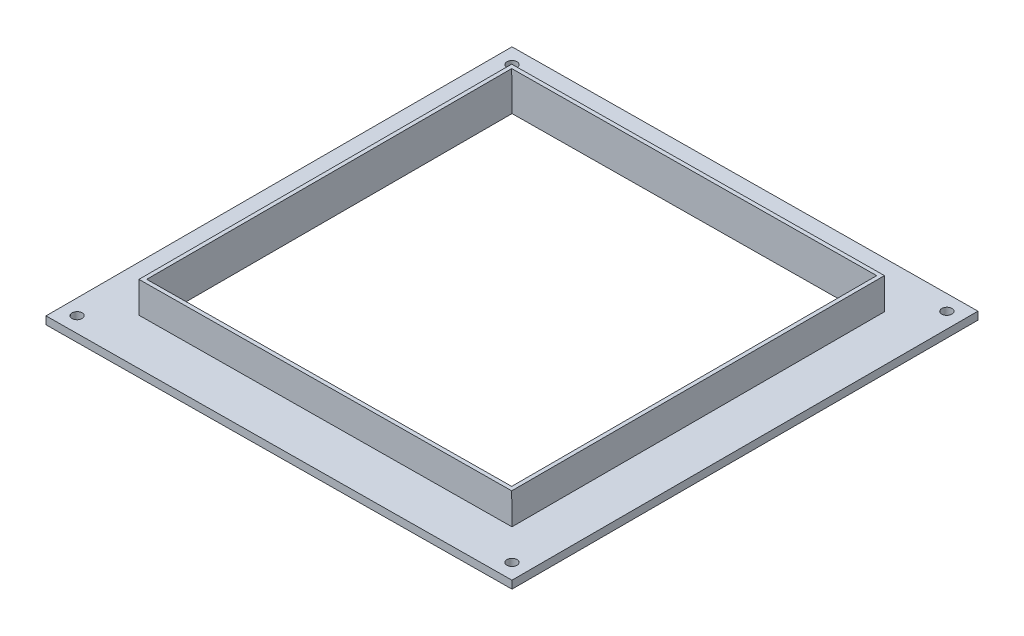
ISO-10303-21;
HEADER;
FILE_DESCRIPTION(('STEP AP214'),'2;1');
FILE_NAME('part.step','',(''),(''),'','','');
FILE_SCHEMA(('AUTOMOTIVE_DESIGN { 1 0 10303 214 1 1 1 1 }'));
ENDSEC;
DATA;
#1=APPLICATION_CONTEXT('core data for automotive mechanical design processes');
#2=APPLICATION_PROTOCOL_DEFINITION('international standard','automotive_design',2000,#1);
#3=PRODUCT_CONTEXT('',#1,'mechanical');
#4=PRODUCT('Part','Part','',(#3));
#5=PRODUCT_RELATED_PRODUCT_CATEGORY('part','',(#4));
#6=PRODUCT_DEFINITION_FORMATION('','',#4);
#7=PRODUCT_DEFINITION_CONTEXT('part definition',#1,'design');
#8=PRODUCT_DEFINITION('design','',#6,#7);
#9=PRODUCT_DEFINITION_SHAPE('','',#8);
#10=(LENGTH_UNIT() NAMED_UNIT(*) SI_UNIT(.MILLI.,.METRE.));
#11=(NAMED_UNIT(*) PLANE_ANGLE_UNIT() SI_UNIT($,.RADIAN.));
#12=(NAMED_UNIT(*) SI_UNIT($,.STERADIAN.) SOLID_ANGLE_UNIT());
#13=UNCERTAINTY_MEASURE_WITH_UNIT(LENGTH_MEASURE(1.E-05),#10,'distance_accuracy_value','');
#14=(GEOMETRIC_REPRESENTATION_CONTEXT(3) GLOBAL_UNCERTAINTY_ASSIGNED_CONTEXT((#13)) GLOBAL_UNIT_ASSIGNED_CONTEXT((#10,
#11,#12)) REPRESENTATION_CONTEXT('',''));
#15=CARTESIAN_POINT('',(0.,0.,0.));
#16=DIRECTION('',(0.,0.,1.));
#17=DIRECTION('',(1.,0.,0.));
#18=AXIS2_PLACEMENT_3D('',#15,#16,#17);
#19=CARTESIAN_POINT('',(-0.14700283086852,3.73493792949448,-300.));
#20=DIRECTION('',(0.,0.,-1.));
#21=DIRECTION('',(-0.999961923064156,-0.0087265355001616,0.));
#22=AXIS2_PLACEMENT_3D('',#19,#20,#21);
#23=PLANE('',#22);
#24=DIRECTION('',(0.999961923064156,0.0087265355001616,0.));
#25=VECTOR('',#24,1.);
#26=CARTESIAN_POINT('',(-0.103370153367727,-1.26487168582629,-300.));
#27=LINE('',#26,#25);
#28=CARTESIAN_POINT('',(-0.103370153367727,-1.26487168582629,-300.));
#29=VERTEX_POINT('',#28);
#30=CARTESIAN_POINT('',(299.885206765879,1.35308896422218,-300.));
#31=VERTEX_POINT('',#30);
#32=EDGE_CURVE('E180',#29,#31,#27,.T.);
#33=ORIENTED_EDGE('',*,*,#32,.F.);
#34=DIRECTION('',(0.0087265355001616,-0.999961923064156,0.));
#35=VECTOR('',#34,1.);
#36=CARTESIAN_POINT('',(-0.14700283086852,3.73493792949448,-300.));
#37=LINE('',#36,#35);
#38=CARTESIAN_POINT('',(-0.14700283086852,3.73493792949448,-300.));
#39=VERTEX_POINT('',#38);
#40=EDGE_CURVE('E168',#39,#29,#37,.T.);
#41=ORIENTED_EDGE('',*,*,#40,.F.);
#42=DIRECTION('',(0.999961923064156,0.0087265355001616,0.));
#43=VECTOR('',#42,1.);
#44=CARTESIAN_POINT('',(-0.14700283086852,3.73493792949448,-300.));
#45=LINE('',#44,#43);
#46=CARTESIAN_POINT('',(299.841574088378,6.35289857954296,-300.));
#47=VERTEX_POINT('',#46);
#48=EDGE_CURVE('E203',#39,#47,#45,.T.);
#49=ORIENTED_EDGE('',*,*,#48,.T.);
#50=DIRECTION('',(0.0087265355001616,-0.999961923064156,0.));
#51=VECTOR('',#50,1.);
#52=CARTESIAN_POINT('',(299.841574088378,6.35289857954296,-300.));
#53=LINE('',#52,#51);
#54=EDGE_CURVE('E197',#47,#31,#53,.T.);
#55=ORIENTED_EDGE('',*,*,#54,.T.);
#56=EDGE_LOOP('',(#33,#41,#49,#55));
#57=FACE_BOUND('',#56,.T.);
#58=ADVANCED_FACE('F64',(#57),#23,.T.);
#59=CARTESIAN_POINT('',(-0.14700283086852,3.73493792949448,0.));
#60=DIRECTION('',(-0.999961923064156,-0.0087265355001616,0.));
#61=DIRECTION('',(0.,0.,1.));
#62=AXIS2_PLACEMENT_3D('',#59,#60,#61);
#63=PLANE('',#62);
#64=DIRECTION('',(0.,0.,-1.));
#65=VECTOR('',#64,1.);
#66=CARTESIAN_POINT('',(-0.103370153367727,-1.26487168582629,0.));
#67=LINE('',#66,#65);
#68=CARTESIAN_POINT('',(-0.103370153367727,-1.26487168582629,0.));
#69=VERTEX_POINT('',#68);
#70=EDGE_CURVE('E206',#69,#29,#67,.T.);
#71=ORIENTED_EDGE('',*,*,#70,.F.);
#72=DIRECTION('',(0.0087265355001616,-0.999961923064156,0.));
#73=VECTOR('',#72,1.);
#74=CARTESIAN_POINT('',(-0.14700283086852,3.73493792949448,0.));
#75=LINE('',#74,#73);
#76=CARTESIAN_POINT('',(-0.14700283086852,3.73493792949448,0.));
#77=VERTEX_POINT('',#76);
#78=EDGE_CURVE('E192',#77,#69,#75,.T.);
#79=ORIENTED_EDGE('',*,*,#78,.F.);
#80=DIRECTION('',(0.,0.,-1.));
#81=VECTOR('',#80,1.);
#82=CARTESIAN_POINT('',(-0.14700283086852,3.73493792949448,0.));
#83=LINE('',#82,#81);
#84=EDGE_CURVE('E214',#77,#39,#83,.T.);
#85=ORIENTED_EDGE('',*,*,#84,.T.);
#86=ORIENTED_EDGE('',*,*,#40,.T.);
#87=EDGE_LOOP('',(#71,#79,#85,#86));
#88=FACE_BOUND('',#87,.T.);
#89=ADVANCED_FACE('F288',(#88),#63,.T.);
#90=CARTESIAN_POINT('',(-0.14700283086852,3.73493792949448,0.));
#91=DIRECTION('',(0.,0.,-1.));
#92=DIRECTION('',(-0.999961923064156,-0.0087265355001616,0.));
#93=AXIS2_PLACEMENT_3D('',#90,#91,#92);
#94=PLANE('',#93);
#95=DIRECTION('',(0.999961923064156,0.0087265355001616,0.));
#96=VECTOR('',#95,1.);
#97=CARTESIAN_POINT('',(-0.103370153367727,-1.26487168582629,0.));
#98=LINE('',#97,#96);
#99=CARTESIAN_POINT('',(299.885206765879,1.35308896422218,0.));
#100=VERTEX_POINT('',#99);
#101=EDGE_CURVE('E204',#69,#100,#98,.T.);
#102=ORIENTED_EDGE('',*,*,#101,.T.);
#103=DIRECTION('',(0.0087265355001616,-0.999961923064156,0.));
#104=VECTOR('',#103,1.);
#105=CARTESIAN_POINT('',(299.841574088378,6.35289857954296,0.));
#106=LINE('',#105,#104);
#107=CARTESIAN_POINT('',(299.841574088378,6.35289857954296,0.));
#108=VERTEX_POINT('',#107);
#109=EDGE_CURVE('E194',#108,#100,#106,.T.);
#110=ORIENTED_EDGE('',*,*,#109,.F.);
#111=DIRECTION('',(0.999961923064156,0.0087265355001616,0.));
#112=VECTOR('',#111,1.);
#113=CARTESIAN_POINT('',(-0.14700283086852,3.73493792949448,0.));
#114=LINE('',#113,#112);
#115=EDGE_CURVE('E212',#77,#108,#114,.T.);
#116=ORIENTED_EDGE('',*,*,#115,.F.);
#117=ORIENTED_EDGE('',*,*,#78,.T.);
#118=EDGE_LOOP('',(#102,#110,#116,#117));
#119=FACE_BOUND('',#118,.T.);
#120=ADVANCED_FACE('F293',(#119),#94,.F.);
#121=CARTESIAN_POINT('',(299.841574088378,6.35289857954296,0.));
#122=DIRECTION('',(-0.999961923064156,-0.0087265355001616,0.));
#123=DIRECTION('',(0.,0.,1.));
#124=AXIS2_PLACEMENT_3D('',#121,#122,#123);
#125=PLANE('',#124);
#126=DIRECTION('',(0.,0.,-1.));
#127=VECTOR('',#126,1.);
#128=CARTESIAN_POINT('',(299.885206765879,1.35308896422218,0.));
#129=LINE('',#128,#127);
#130=EDGE_CURVE('E200',#100,#31,#129,.T.);
#131=ORIENTED_EDGE('',*,*,#130,.T.);
#132=ORIENTED_EDGE('',*,*,#54,.F.);
#133=DIRECTION('',(0.,0.,-1.));
#134=VECTOR('',#133,1.);
#135=CARTESIAN_POINT('',(299.841574088378,6.35289857954296,0.));
#136=LINE('',#135,#134);
#137=EDGE_CURVE('E199',#108,#47,#136,.T.);
#138=ORIENTED_EDGE('',*,*,#137,.F.);
#139=ORIENTED_EDGE('',*,*,#109,.T.);
#140=EDGE_LOOP('',(#131,#132,#138,#139));
#141=FACE_BOUND('',#140,.T.);
#142=ADVANCED_FACE('F309',(#141),#125,.F.);
#143=CARTESIAN_POINT('',(-0.103370153367727,-1.26487168582629,0.));
#144=DIRECTION('',(-0.0087265355001616,0.999961923064156,0.));
#145=DIRECTION('',(0.,0.,1.));
#146=AXIS2_PLACEMENT_3D('',#143,#144,#145);
#147=PLANE('',#146);
#148=DIRECTION('',(-0.999961923064156,-0.0087265355001616,0.));
#149=VECTOR('',#148,1.);
#150=CARTESIAN_POINT('',(-0.103370153367727,-1.26487168582629,-267.5));
#151=LINE('',#150,#149);
#152=CARTESIAN_POINT('',(267.386444266294,1.06947656046694,-267.5));
#153=VERTEX_POINT('',#152);
#154=CARTESIAN_POINT('',(32.3953923462174,-0.981259282071045,-267.5));
#155=VERTEX_POINT('',#154);
#156=EDGE_CURVE('E71',#153,#155,#151,.T.);
#157=ORIENTED_EDGE('',*,*,#156,.T.);
#158=DIRECTION('',(0.,0.,1.));
#159=VECTOR('',#158,1.);
#160=CARTESIAN_POINT('',(32.3953923462174,-0.981259282071045,0.));
#161=LINE('',#160,#159);
#162=CARTESIAN_POINT('',(32.3953923462174,-0.981259282071045,-32.5));
#163=VERTEX_POINT('',#162);
#164=EDGE_CURVE('E12',#155,#163,#161,.T.);
#165=ORIENTED_EDGE('',*,*,#164,.T.);
#166=DIRECTION('',(0.999961923064156,0.0087265355001616,0.));
#167=VECTOR('',#166,1.);
#168=CARTESIAN_POINT('',(-0.103370153367727,-1.26487168582629,-32.5));
#169=LINE('',#168,#167);
#170=CARTESIAN_POINT('',(267.386444266294,1.06947656046694,-32.5));
#171=VERTEX_POINT('',#170);
#172=EDGE_CURVE('E163',#163,#171,#169,.T.);
#173=ORIENTED_EDGE('',*,*,#172,.T.);
#174=DIRECTION('',(0.,0.,-1.));
#175=VECTOR('',#174,1.);
#176=CARTESIAN_POINT('',(267.386444266294,1.06947656046694,0.));
#177=LINE('',#176,#175);
#178=EDGE_CURVE('E167',#171,#153,#177,.T.);
#179=ORIENTED_EDGE('',*,*,#178,.T.);
#180=EDGE_LOOP('',(#157,#165,#173,#179));
#181=FACE_BOUND('',#180,.T.);
#182=CARTESIAN_POINT('',(9.89624907727382,-1.17760633082467,-290.));
#183=DIRECTION('',(-0.0087265355001616,0.999961923064156,0.));
#184=DIRECTION('',(0.,0.,1.));
#185=AXIS2_PLACEMENT_3D('',#182,#183,#184);
#186=CIRCLE('',#185,3.25);
#187=CARTESIAN_POINT('',(9.89624907727382,-1.17760633082467,-286.75));
#188=VERTEX_POINT('',#187);
#189=EDGE_CURVE('E177',#188,#188,#186,.T.);
#190=ORIENTED_EDGE('',*,*,#189,.T.);
#191=EDGE_LOOP('',(#190));
#192=FACE_BOUND('',#191,.T.);
#193=CARTESIAN_POINT('',(289.885587535238,1.26582360922056,-290.));
#194=DIRECTION('',(-0.0087265355001616,0.999961923064156,0.));
#195=DIRECTION('',(0.,0.,1.));
#196=AXIS2_PLACEMENT_3D('',#193,#194,#195);
#197=CIRCLE('',#196,3.24999999999995);
#198=CARTESIAN_POINT('',(289.885587535238,1.26582360922056,-286.75));
#199=VERTEX_POINT('',#198);
#200=EDGE_CURVE('E181',#199,#199,#197,.T.);
#201=ORIENTED_EDGE('',*,*,#200,.T.);
#202=EDGE_LOOP('',(#201));
#203=FACE_BOUND('',#202,.T.);
#204=CARTESIAN_POINT('',(289.885587535238,1.26582360922056,-10.));
#205=DIRECTION('',(-0.0087265355001616,0.999961923064156,0.));
#206=DIRECTION('',(0.,0.,1.));
#207=AXIS2_PLACEMENT_3D('',#204,#205,#206);
#208=CIRCLE('',#207,3.24999999999995);
#209=CARTESIAN_POINT('',(289.885587535238,1.26582360922056,-6.75000000000005));
#210=VERTEX_POINT('',#209);
#211=EDGE_CURVE('E184',#210,#210,#208,.T.);
#212=ORIENTED_EDGE('',*,*,#211,.T.);
#213=EDGE_LOOP('',(#212));
#214=FACE_BOUND('',#213,.T.);
#215=CARTESIAN_POINT('',(9.89624907727382,-1.17760633082467,-10.));
#216=DIRECTION('',(-0.0087265355001616,0.999961923064156,0.));
#217=DIRECTION('',(0.,0.,1.));
#218=AXIS2_PLACEMENT_3D('',#215,#216,#217);
#219=CIRCLE('',#218,3.25);
#220=CARTESIAN_POINT('',(9.89624907727382,-1.17760633082467,-6.75));
#221=VERTEX_POINT('',#220);
#222=EDGE_CURVE('E187',#221,#221,#219,.T.);
#223=ORIENTED_EDGE('',*,*,#222,.T.);
#224=EDGE_LOOP('',(#223));
#225=FACE_BOUND('',#224,.T.);
#226=ORIENTED_EDGE('',*,*,#32,.T.);
#227=ORIENTED_EDGE('',*,*,#130,.F.);
#228=ORIENTED_EDGE('',*,*,#101,.F.);
#229=ORIENTED_EDGE('',*,*,#70,.T.);
#230=EDGE_LOOP('',(#226,#227,#228,#229));
#231=FACE_BOUND('',#230,.T.);
#232=ADVANCED_FACE('F170',(#181,#192,#203,#214,#225,#231),#147,.F.);
#233=CARTESIAN_POINT('',(10.0271471097763,-16.177035176787,-10.));
#234=DIRECTION('',(-0.0087265355001616,0.999961923064156,0.));
#235=DIRECTION('',(0.,0.,1.));
#236=AXIS2_PLACEMENT_3D('',#233,#234,#235);
#237=CYLINDRICAL_SURFACE('',#236,3.25);
#238=CARTESIAN_POINT('',(9.85261639977303,3.82220328449609,-10.));
#239=DIRECTION('',(-0.0087265355001616,0.999961923064156,0.));
#240=DIRECTION('',(0.,0.,1.));
#241=AXIS2_PLACEMENT_3D('',#238,#239,#240);
#242=CIRCLE('',#241,3.25);
#243=CARTESIAN_POINT('',(9.85261639977303,3.82220328449609,-6.75));
#244=VERTEX_POINT('',#243);
#245=EDGE_CURVE('E190',#244,#244,#242,.T.);
#246=ORIENTED_EDGE('',*,*,#245,.T.);
#247=EDGE_LOOP('',(#246));
#248=FACE_BOUND('',#247,.T.);
#249=ORIENTED_EDGE('',*,*,#222,.F.);
#250=EDGE_LOOP('',(#249));
#251=FACE_BOUND('',#250,.T.);
#252=ADVANCED_FACE('F320',(#248,#251),#237,.F.);
#253=CARTESIAN_POINT('',(290.01648556774,-13.7336052367418,-10.));
#254=DIRECTION('',(-0.0087265355001616,0.999961923064156,0.));
#255=DIRECTION('',(0.,0.,1.));
#256=AXIS2_PLACEMENT_3D('',#253,#254,#255);
#257=CYLINDRICAL_SURFACE('',#256,3.24999999999995);
#258=CARTESIAN_POINT('',(289.841954857737,6.26563322454135,-10.));
#259=DIRECTION('',(-0.0087265355001616,0.999961923064156,0.));
#260=DIRECTION('',(0.,0.,1.));
#261=AXIS2_PLACEMENT_3D('',#258,#259,#260);
#262=CIRCLE('',#261,3.24999999999995);
#263=CARTESIAN_POINT('',(289.841954857737,6.26563322454135,-6.75000000000005));
#264=VERTEX_POINT('',#263);
#265=EDGE_CURVE('E221',#264,#264,#262,.T.);
#266=ORIENTED_EDGE('',*,*,#265,.T.);
#267=EDGE_LOOP('',(#266));
#268=FACE_BOUND('',#267,.T.);
#269=ORIENTED_EDGE('',*,*,#211,.F.);
#270=EDGE_LOOP('',(#269));
#271=FACE_BOUND('',#270,.T.);
#272=ADVANCED_FACE('F327',(#268,#271),#257,.F.);
#273=CARTESIAN_POINT('',(290.01648556774,-13.7336052367418,-290.));
#274=DIRECTION('',(-0.0087265355001616,0.999961923064156,0.));
#275=DIRECTION('',(0.,0.,1.));
#276=AXIS2_PLACEMENT_3D('',#273,#274,#275);
#277=CYLINDRICAL_SURFACE('',#276,3.24999999999995);
#278=CARTESIAN_POINT('',(289.841954857737,6.26563322454135,-290.));
#279=DIRECTION('',(-0.0087265355001616,0.999961923064156,0.));
#280=DIRECTION('',(0.,0.,1.));
#281=AXIS2_PLACEMENT_3D('',#278,#279,#280);
#282=CIRCLE('',#281,3.24999999999995);
#283=CARTESIAN_POINT('',(289.841954857737,6.26563322454135,-286.75));
#284=VERTEX_POINT('',#283);
#285=EDGE_CURVE('E225',#284,#284,#282,.T.);
#286=ORIENTED_EDGE('',*,*,#285,.T.);
#287=EDGE_LOOP('',(#286));
#288=FACE_BOUND('',#287,.T.);
#289=ORIENTED_EDGE('',*,*,#200,.F.);
#290=EDGE_LOOP('',(#289));
#291=FACE_BOUND('',#290,.T.);
#292=ADVANCED_FACE('F331',(#288,#291),#277,.F.);
#293=CARTESIAN_POINT('',(10.0271471097763,-16.177035176787,-290.));
#294=DIRECTION('',(-0.0087265355001616,0.999961923064156,0.));
#295=DIRECTION('',(0.,0.,1.));
#296=AXIS2_PLACEMENT_3D('',#293,#294,#295);
#297=CYLINDRICAL_SURFACE('',#296,3.25);
#298=CARTESIAN_POINT('',(9.85261639977303,3.82220328449609,-290.));
#299=DIRECTION('',(-0.0087265355001616,0.999961923064156,0.));
#300=DIRECTION('',(0.,0.,1.));
#301=AXIS2_PLACEMENT_3D('',#298,#299,#300);
#302=CIRCLE('',#301,3.25);
#303=CARTESIAN_POINT('',(9.85261639977303,3.82220328449609,-286.75));
#304=VERTEX_POINT('',#303);
#305=EDGE_CURVE('E222',#304,#304,#302,.T.);
#306=ORIENTED_EDGE('',*,*,#305,.T.);
#307=EDGE_LOOP('',(#306));
#308=FACE_BOUND('',#307,.T.);
#309=ORIENTED_EDGE('',*,*,#189,.F.);
#310=EDGE_LOOP('',(#309));
#311=FACE_BOUND('',#310,.T.);
#312=ADVANCED_FACE('F324',(#308,#311),#297,.F.);
#313=CARTESIAN_POINT('',(-0.14700283086852,3.73493792949448,0.));
#314=DIRECTION('',(-0.0087265355001616,0.999961923064156,0.));
#315=DIRECTION('',(0.,0.,1.));
#316=AXIS2_PLACEMENT_3D('',#313,#314,#315);
#317=PLANE('',#316);
#318=DIRECTION('',(0.,0.,-1.));
#319=VECTOR('',#318,1.);
#320=CARTESIAN_POINT('',(29.8518548610562,3.99673399449935,0.));
#321=LINE('',#320,#319);
#322=CARTESIAN_POINT('',(29.8518548610562,3.99673399449935,-30.));
#323=VERTEX_POINT('',#322);
#324=CARTESIAN_POINT('',(29.8518548610562,3.99673399449935,-270.));
#325=VERTEX_POINT('',#324);
#326=EDGE_CURVE('E252',#323,#325,#321,.T.);
#327=ORIENTED_EDGE('',*,*,#326,.T.);
#328=DIRECTION('',(0.999961923064156,0.0087265355001616,0.));
#329=VECTOR('',#328,1.);
#330=CARTESIAN_POINT('',(-0.14700283086852,3.73493792949448,-270.));
#331=LINE('',#330,#329);
#332=CARTESIAN_POINT('',(269.842716396454,6.09110251453812,-270.));
#333=VERTEX_POINT('',#332);
#334=EDGE_CURVE('E245',#325,#333,#331,.T.);
#335=ORIENTED_EDGE('',*,*,#334,.T.);
#336=DIRECTION('',(0.,0.,-1.));
#337=VECTOR('',#336,1.);
#338=CARTESIAN_POINT('',(269.842716396454,6.09110251453812,0.));
#339=LINE('',#338,#337);
#340=CARTESIAN_POINT('',(269.842716396454,6.09110251453812,-30.));
#341=VERTEX_POINT('',#340);
#342=EDGE_CURVE('E248',#341,#333,#339,.T.);
#343=ORIENTED_EDGE('',*,*,#342,.F.);
#344=DIRECTION('',(0.999961923064156,0.0087265355001616,0.));
#345=VECTOR('',#344,1.);
#346=CARTESIAN_POINT('',(-0.14700283086852,3.73493792949448,-30.));
#347=LINE('',#346,#345);
#348=EDGE_CURVE('E86',#323,#341,#347,.T.);
#349=ORIENTED_EDGE('',*,*,#348,.F.);
#350=EDGE_LOOP('',(#327,#335,#343,#349));
#351=FACE_BOUND('',#350,.T.);
#352=ORIENTED_EDGE('',*,*,#305,.F.);
#353=EDGE_LOOP('',(#352));
#354=FACE_BOUND('',#353,.T.);
#355=ORIENTED_EDGE('',*,*,#285,.F.);
#356=EDGE_LOOP('',(#355));
#357=FACE_BOUND('',#356,.T.);
#358=ORIENTED_EDGE('',*,*,#265,.F.);
#359=EDGE_LOOP('',(#358));
#360=FACE_BOUND('',#359,.T.);
#361=ORIENTED_EDGE('',*,*,#245,.F.);
#362=EDGE_LOOP('',(#361));
#363=FACE_BOUND('',#362,.T.);
#364=ORIENTED_EDGE('',*,*,#48,.F.);
#365=ORIENTED_EDGE('',*,*,#84,.F.);
#366=ORIENTED_EDGE('',*,*,#115,.T.);
#367=ORIENTED_EDGE('',*,*,#137,.T.);
#368=EDGE_LOOP('',(#364,#365,#366,#367));
#369=FACE_BOUND('',#368,.T.);
#370=ADVANCED_FACE('F305',(#351,#354,#357,#360,#363,#369),#317,.T.);
#371=CARTESIAN_POINT('',(29.6773241510529,23.9959724557824,0.));
#372=DIRECTION('',(-0.999961923064156,-0.0087265355001616,0.));
#373=DIRECTION('',(0.,0.,1.));
#374=AXIS2_PLACEMENT_3D('',#371,#372,#373);
#375=PLANE('',#374);
#376=ORIENTED_EDGE('',*,*,#326,.F.);
#377=DIRECTION('',(0.0087265355001616,-0.999961923064156,0.));
#378=VECTOR('',#377,1.);
#379=CARTESIAN_POINT('',(29.6773241510529,23.9959724557824,-30.));
#380=LINE('',#379,#378);
#381=CARTESIAN_POINT('',(29.6773241510529,23.9959724557824,-30.));
#382=VERTEX_POINT('',#381);
#383=EDGE_CURVE('E226',#382,#323,#380,.T.);
#384=ORIENTED_EDGE('',*,*,#383,.F.);
#385=DIRECTION('',(0.,0.,-1.));
#386=VECTOR('',#385,1.);
#387=CARTESIAN_POINT('',(29.6773241510529,23.9959724557824,0.));
#388=LINE('',#387,#386);
#389=CARTESIAN_POINT('',(29.6773241510529,23.9959724557824,-270.));
#390=VERTEX_POINT('',#389);
#391=EDGE_CURVE('E261',#382,#390,#388,.T.);
#392=ORIENTED_EDGE('',*,*,#391,.T.);
#393=DIRECTION('',(0.0087265355001616,-0.999961923064156,0.));
#394=VECTOR('',#393,1.);
#395=CARTESIAN_POINT('',(29.6773241510529,23.9959724557824,-270.));
#396=LINE('',#395,#394);
#397=EDGE_CURVE('E159',#390,#325,#396,.T.);
#398=ORIENTED_EDGE('',*,*,#397,.T.);
#399=EDGE_LOOP('',(#376,#384,#392,#398));
#400=FACE_BOUND('',#399,.T.);
#401=ADVANCED_FACE('F323',(#400),#375,.T.);
#402=CARTESIAN_POINT('',(-0.321533540871749,23.7341763907776,-30.));
#403=DIRECTION('',(0.,0.,-1.));
#404=DIRECTION('',(-0.999961923064156,-0.0087265355001616,0.));
#405=AXIS2_PLACEMENT_3D('',#402,#403,#404);
#406=PLANE('',#405);
#407=ORIENTED_EDGE('',*,*,#348,.T.);
#408=DIRECTION('',(0.0087265355001616,-0.999961923064156,0.));
#409=VECTOR('',#408,1.);
#410=CARTESIAN_POINT('',(269.66818568645,26.0903409758212,-30.));
#411=LINE('',#410,#409);
#412=CARTESIAN_POINT('',(269.66818568645,26.0903409758212,-30.));
#413=VERTEX_POINT('',#412);
#414=EDGE_CURVE('E237',#413,#341,#411,.T.);
#415=ORIENTED_EDGE('',*,*,#414,.F.);
#416=DIRECTION('',(0.999961923064156,0.0087265355001616,0.));
#417=VECTOR('',#416,1.);
#418=CARTESIAN_POINT('',(-0.321533540871749,23.7341763907776,-30.));
#419=LINE('',#418,#417);
#420=EDGE_CURVE('E258',#382,#413,#419,.T.);
#421=ORIENTED_EDGE('',*,*,#420,.F.);
#422=ORIENTED_EDGE('',*,*,#383,.T.);
#423=EDGE_LOOP('',(#407,#415,#421,#422));
#424=FACE_BOUND('',#423,.T.);
#425=ADVANCED_FACE('F344',(#424),#406,.F.);
#426=CARTESIAN_POINT('',(269.66818568645,26.0903409758212,0.));
#427=DIRECTION('',(-0.999961923064156,-0.0087265355001616,0.));
#428=DIRECTION('',(0.,0.,1.));
#429=AXIS2_PLACEMENT_3D('',#426,#427,#428);
#430=PLANE('',#429);
#431=ORIENTED_EDGE('',*,*,#342,.T.);
#432=DIRECTION('',(0.0087265355001616,-0.999961923064156,0.));
#433=VECTOR('',#432,1.);
#434=CARTESIAN_POINT('',(269.66818568645,26.0903409758212,-270.));
#435=LINE('',#434,#433);
#436=CARTESIAN_POINT('',(269.66818568645,26.0903409758212,-270.));
#437=VERTEX_POINT('',#436);
#438=EDGE_CURVE('E240',#437,#333,#435,.T.);
#439=ORIENTED_EDGE('',*,*,#438,.F.);
#440=DIRECTION('',(0.,0.,-1.));
#441=VECTOR('',#440,1.);
#442=CARTESIAN_POINT('',(269.66818568645,26.0903409758212,0.));
#443=LINE('',#442,#441);
#444=EDGE_CURVE('E256',#413,#437,#443,.T.);
#445=ORIENTED_EDGE('',*,*,#444,.F.);
#446=ORIENTED_EDGE('',*,*,#414,.T.);
#447=EDGE_LOOP('',(#431,#439,#445,#446));
#448=FACE_BOUND('',#447,.T.);
#449=ADVANCED_FACE('F340',(#448),#430,.F.);
#450=CARTESIAN_POINT('',(-0.321533540871749,23.7341763907776,-32.5));
#451=DIRECTION('',(0.,0.,-1.));
#452=DIRECTION('',(-0.999961923064156,-0.0087265355001616,0.));
#453=AXIS2_PLACEMENT_3D('',#450,#451,#452);
#454=PLANE('',#453);
#455=DIRECTION('',(0.0087265355001616,-0.999961923064156,0.));
#456=VECTOR('',#455,1.);
#457=CARTESIAN_POINT('',(267.16828087879,26.0685246370709,-32.5));
#458=LINE('',#457,#456);
#459=CARTESIAN_POINT('',(267.16828087879,26.0685246370709,-32.5));
#460=VERTEX_POINT('',#459);
#461=EDGE_CURVE('E78',#460,#171,#458,.T.);
#462=ORIENTED_EDGE('',*,*,#461,.T.);
#463=ORIENTED_EDGE('',*,*,#172,.F.);
#464=DIRECTION('',(0.0087265355001616,-0.999961923064156,0.));
#465=VECTOR('',#464,1.);
#466=CARTESIAN_POINT('',(32.1772289587133,24.0177887945328,-32.5));
#467=LINE('',#466,#465);
#468=CARTESIAN_POINT('',(32.1772289587133,24.0177887945328,-32.5));
#469=VERTEX_POINT('',#468);
#470=EDGE_CURVE('E153',#469,#163,#467,.T.);
#471=ORIENTED_EDGE('',*,*,#470,.F.);
#472=DIRECTION('',(0.999961923064156,0.0087265355001616,0.));
#473=VECTOR('',#472,1.);
#474=CARTESIAN_POINT('',(-0.321533540871749,23.7341763907776,-32.5));
#475=LINE('',#474,#473);
#476=EDGE_CURVE('E247',#469,#460,#475,.T.);
#477=ORIENTED_EDGE('',*,*,#476,.T.);
#478=EDGE_LOOP('',(#462,#463,#471,#477));
#479=FACE_BOUND('',#478,.T.);
#480=ADVANCED_FACE('F164',(#479),#454,.T.);
#481=CARTESIAN_POINT('',(32.1772289587133,24.0177887945328,0.));
#482=DIRECTION('',(-0.999961923064156,-0.0087265355001616,0.));
#483=DIRECTION('',(0.,0.,1.));
#484=AXIS2_PLACEMENT_3D('',#481,#482,#483);
#485=PLANE('',#484);
#486=ORIENTED_EDGE('',*,*,#470,.T.);
#487=ORIENTED_EDGE('',*,*,#164,.F.);
#488=DIRECTION('',(0.0087265355001616,-0.999961923064156,0.));
#489=VECTOR('',#488,1.);
#490=CARTESIAN_POINT('',(32.1772289587133,24.0177887945328,-267.5));
#491=LINE('',#490,#489);
#492=CARTESIAN_POINT('',(32.1772289587133,24.0177887945328,-267.5));
#493=VERTEX_POINT('',#492);
#494=EDGE_CURVE('E160',#493,#155,#491,.T.);
#495=ORIENTED_EDGE('',*,*,#494,.F.);
#496=DIRECTION('',(0.,0.,-1.));
#497=VECTOR('',#496,1.);
#498=CARTESIAN_POINT('',(32.1772289587133,24.0177887945328,0.));
#499=LINE('',#498,#497);
#500=EDGE_CURVE('E157',#469,#493,#499,.T.);
#501=ORIENTED_EDGE('',*,*,#500,.F.);
#502=EDGE_LOOP('',(#486,#487,#495,#501));
#503=FACE_BOUND('',#502,.T.);
#504=ADVANCED_FACE('F154',(#503),#485,.F.);
#505=CARTESIAN_POINT('',(-0.321533540871749,23.7341763907776,-267.5));
#506=DIRECTION('',(0.,0.,-1.));
#507=DIRECTION('',(-0.999961923064156,-0.0087265355001616,0.));
#508=AXIS2_PLACEMENT_3D('',#505,#506,#507);
#509=PLANE('',#508);
#510=ORIENTED_EDGE('',*,*,#494,.T.);
#511=ORIENTED_EDGE('',*,*,#156,.F.);
#512=DIRECTION('',(0.0087265355001616,-0.999961923064156,0.));
#513=VECTOR('',#512,1.);
#514=CARTESIAN_POINT('',(267.16828087879,26.0685246370709,-267.5));
#515=LINE('',#514,#513);
#516=CARTESIAN_POINT('',(267.16828087879,26.0685246370709,-267.5));
#517=VERTEX_POINT('',#516);
#518=EDGE_CURVE('E232',#517,#153,#515,.T.);
#519=ORIENTED_EDGE('',*,*,#518,.F.);
#520=DIRECTION('',(0.999961923064156,0.0087265355001616,0.));
#521=VECTOR('',#520,1.);
#522=CARTESIAN_POINT('',(-0.321533540871749,23.7341763907776,-267.5));
#523=LINE('',#522,#521);
#524=EDGE_CURVE('E267',#493,#517,#523,.T.);
#525=ORIENTED_EDGE('',*,*,#524,.F.);
#526=EDGE_LOOP('',(#510,#511,#519,#525));
#527=FACE_BOUND('',#526,.T.);
#528=ADVANCED_FACE('F277',(#527),#509,.F.);
#529=CARTESIAN_POINT('',(267.16828087879,26.0685246370709,0.));
#530=DIRECTION('',(-0.999961923064156,-0.0087265355001616,0.));
#531=DIRECTION('',(0.,0.,1.));
#532=AXIS2_PLACEMENT_3D('',#529,#530,#531);
#533=PLANE('',#532);
#534=ORIENTED_EDGE('',*,*,#518,.T.);
#535=ORIENTED_EDGE('',*,*,#178,.F.);
#536=ORIENTED_EDGE('',*,*,#461,.F.);
#537=DIRECTION('',(0.,0.,-1.));
#538=VECTOR('',#537,1.);
#539=CARTESIAN_POINT('',(267.16828087879,26.0685246370709,0.));
#540=LINE('',#539,#538);
#541=EDGE_CURVE('E264',#460,#517,#540,.T.);
#542=ORIENTED_EDGE('',*,*,#541,.T.);
#543=EDGE_LOOP('',(#534,#535,#536,#542));
#544=FACE_BOUND('',#543,.T.);
#545=ADVANCED_FACE('F276',(#544),#533,.T.);
#546=CARTESIAN_POINT('',(-0.321533540871749,23.7341763907776,-270.));
#547=DIRECTION('',(0.,0.,-1.));
#548=DIRECTION('',(-0.999961923064156,-0.0087265355001616,0.));
#549=AXIS2_PLACEMENT_3D('',#546,#547,#548);
#550=PLANE('',#549);
#551=ORIENTED_EDGE('',*,*,#334,.F.);
#552=ORIENTED_EDGE('',*,*,#397,.F.);
#553=DIRECTION('',(0.999961923064156,0.0087265355001616,0.));
#554=VECTOR('',#553,1.);
#555=CARTESIAN_POINT('',(-0.321533540871749,23.7341763907776,-270.));
#556=LINE('',#555,#554);
#557=EDGE_CURVE('E235',#390,#437,#556,.T.);
#558=ORIENTED_EDGE('',*,*,#557,.T.);
#559=ORIENTED_EDGE('',*,*,#438,.T.);
#560=EDGE_LOOP('',(#551,#552,#558,#559));
#561=FACE_BOUND('',#560,.T.);
#562=ADVANCED_FACE('F284',(#561),#550,.T.);
#563=CARTESIAN_POINT('',(-0.321533540871749,23.7341763907776,0.));
#564=DIRECTION('',(-0.0087265355001616,0.999961923064156,0.));
#565=DIRECTION('',(0.,0.,1.));
#566=AXIS2_PLACEMENT_3D('',#563,#564,#565);
#567=PLANE('',#566);
#568=ORIENTED_EDGE('',*,*,#476,.F.);
#569=ORIENTED_EDGE('',*,*,#500,.T.);
#570=ORIENTED_EDGE('',*,*,#524,.T.);
#571=ORIENTED_EDGE('',*,*,#541,.F.);
#572=EDGE_LOOP('',(#568,#569,#570,#571));
#573=FACE_BOUND('',#572,.T.);
#574=ORIENTED_EDGE('',*,*,#391,.F.);
#575=ORIENTED_EDGE('',*,*,#420,.T.);
#576=ORIENTED_EDGE('',*,*,#444,.T.);
#577=ORIENTED_EDGE('',*,*,#557,.F.);
#578=EDGE_LOOP('',(#574,#575,#576,#577));
#579=FACE_BOUND('',#578,.T.);
#580=ADVANCED_FACE('F272',(#573,#579),#567,.T.);
#581=CLOSED_SHELL('',(#58,#89,#120,#142,#232,#252,#272,#292,#312,#370,#401,#425,#449,#480,#504,
#528,#545,#562,#580));
#582=MANIFOLD_SOLID_BREP('B2',#581);
#583=ADVANCED_BREP_SHAPE_REPRESENTATION('',(#18,#582),#14);
#584=SHAPE_DEFINITION_REPRESENTATION(#9,#583);
ENDSEC;
END-ISO-10303-21;
